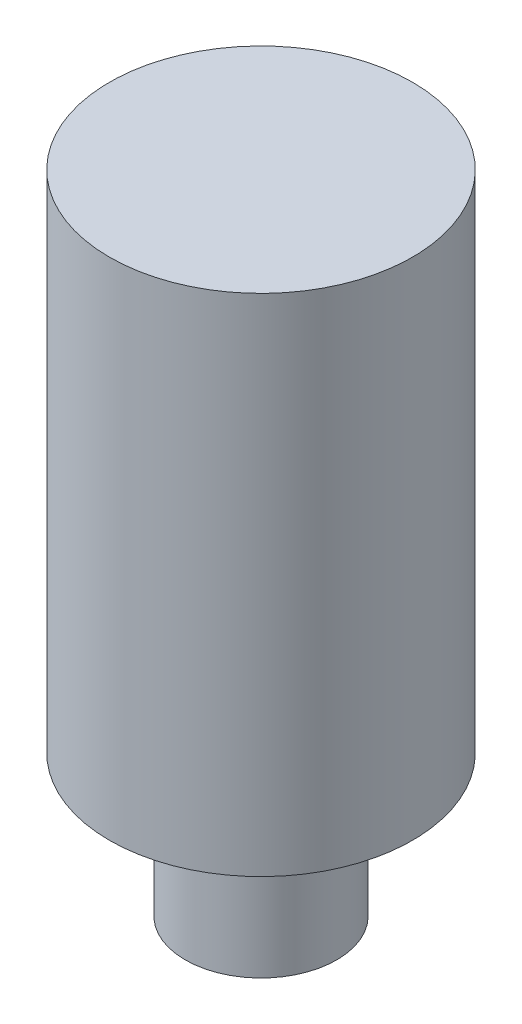
ISO-10303-21;
HEADER;
FILE_DESCRIPTION(('STEP AP214'),'2;1');
FILE_NAME('part.step','',(''),(''),'','','');
FILE_SCHEMA(('AUTOMOTIVE_DESIGN { 1 0 10303 214 1 1 1 1 }'));
ENDSEC;
DATA;
#1=APPLICATION_CONTEXT('core data for automotive mechanical design processes');
#2=APPLICATION_PROTOCOL_DEFINITION('international standard','automotive_design',2000,#1);
#3=PRODUCT_CONTEXT('',#1,'mechanical');
#4=PRODUCT('Part','Part','',(#3));
#5=PRODUCT_RELATED_PRODUCT_CATEGORY('part','',(#4));
#6=PRODUCT_DEFINITION_FORMATION('','',#4);
#7=PRODUCT_DEFINITION_CONTEXT('part definition',#1,'design');
#8=PRODUCT_DEFINITION('design','',#6,#7);
#9=PRODUCT_DEFINITION_SHAPE('','',#8);
#10=(LENGTH_UNIT() NAMED_UNIT(*) SI_UNIT(.MILLI.,.METRE.));
#11=(NAMED_UNIT(*) PLANE_ANGLE_UNIT() SI_UNIT($,.RADIAN.));
#12=(NAMED_UNIT(*) SI_UNIT($,.STERADIAN.) SOLID_ANGLE_UNIT());
#13=UNCERTAINTY_MEASURE_WITH_UNIT(LENGTH_MEASURE(1.E-05),#10,'distance_accuracy_value','');
#14=(GEOMETRIC_REPRESENTATION_CONTEXT(3) GLOBAL_UNCERTAINTY_ASSIGNED_CONTEXT((#13)) GLOBAL_UNIT_ASSIGNED_CONTEXT((#10,
#11,#12)) REPRESENTATION_CONTEXT('',''));
#15=CARTESIAN_POINT('',(0.,0.,0.));
#16=DIRECTION('',(0.,0.,1.));
#17=DIRECTION('',(1.,0.,0.));
#18=AXIS2_PLACEMENT_3D('',#15,#16,#17);
#19=CARTESIAN_POINT('',(0.,2.8,0.));
#20=DIRECTION('',(0.,-1.,0.));
#21=DIRECTION('',(0.,0.,-1.));
#22=AXIS2_PLACEMENT_3D('',#19,#20,#21);
#23=CYLINDRICAL_SURFACE('',#22,1.5);
#24=CARTESIAN_POINT('',(0.,2.8,0.));
#25=DIRECTION('',(0.,1.,0.));
#26=DIRECTION('',(0.,0.,1.));
#27=AXIS2_PLACEMENT_3D('',#24,#25,#26);
#28=CIRCLE('',#27,1.5);
#29=CARTESIAN_POINT('',(0.,2.8,1.5));
#30=VERTEX_POINT('',#29);
#31=EDGE_CURVE('E10',#30,#30,#28,.T.);
#32=ORIENTED_EDGE('',*,*,#31,.F.);
#33=EDGE_LOOP('',(#32));
#34=FACE_BOUND('',#33,.T.);
#35=CARTESIAN_POINT('',(0.,0.,0.));
#36=DIRECTION('',(0.,1.,0.));
#37=DIRECTION('',(0.,0.,1.));
#38=AXIS2_PLACEMENT_3D('',#35,#36,#37);
#39=CIRCLE('',#38,1.5);
#40=CARTESIAN_POINT('',(0.,0.,1.5));
#41=VERTEX_POINT('',#40);
#42=EDGE_CURVE('E40',#41,#41,#39,.T.);
#43=ORIENTED_EDGE('',*,*,#42,.T.);
#44=EDGE_LOOP('',(#43));
#45=FACE_BOUND('',#44,.T.);
#46=ADVANCED_FACE('F37',(#34,#45),#23,.T.);
#47=CARTESIAN_POINT('',(0.,0.,0.));
#48=DIRECTION('',(0.,1.,0.));
#49=DIRECTION('',(0.,0.,1.));
#50=AXIS2_PLACEMENT_3D('',#47,#48,#49);
#51=PLANE('',#50);
#52=ORIENTED_EDGE('',*,*,#42,.F.);
#53=EDGE_LOOP('',(#52));
#54=FACE_BOUND('',#53,.T.);
#55=ADVANCED_FACE('F64',(#54),#51,.F.);
#56=CARTESIAN_POINT('',(0.,12.8,0.));
#57=DIRECTION('',(0.,-1.,0.));
#58=DIRECTION('',(0.,0.,-1.));
#59=AXIS2_PLACEMENT_3D('',#56,#57,#58);
#60=CYLINDRICAL_SURFACE('',#59,3.);
#61=CARTESIAN_POINT('',(0.,12.8,0.));
#62=DIRECTION('',(0.,1.,0.));
#63=DIRECTION('',(0.,0.,1.));
#64=AXIS2_PLACEMENT_3D('',#61,#62,#63);
#65=CIRCLE('',#64,3.);
#66=CARTESIAN_POINT('',(0.,12.8,3.));
#67=VERTEX_POINT('',#66);
#68=EDGE_CURVE('E49',#67,#67,#65,.T.);
#69=ORIENTED_EDGE('',*,*,#68,.F.);
#70=EDGE_LOOP('',(#69));
#71=FACE_BOUND('',#70,.T.);
#72=CARTESIAN_POINT('',(0.,2.8,0.));
#73=DIRECTION('',(0.,1.,0.));
#74=DIRECTION('',(0.,0.,1.));
#75=AXIS2_PLACEMENT_3D('',#72,#73,#74);
#76=CIRCLE('',#75,3.);
#77=CARTESIAN_POINT('',(0.,2.8,3.));
#78=VERTEX_POINT('',#77);
#79=EDGE_CURVE('E51',#78,#78,#76,.T.);
#80=ORIENTED_EDGE('',*,*,#79,.T.);
#81=EDGE_LOOP('',(#80));
#82=FACE_BOUND('',#81,.T.);
#83=ADVANCED_FACE('F61',(#71,#82),#60,.T.);
#84=CARTESIAN_POINT('',(0.,12.8,0.));
#85=DIRECTION('',(0.,1.,0.));
#86=DIRECTION('',(0.,0.,1.));
#87=AXIS2_PLACEMENT_3D('',#84,#85,#86);
#88=PLANE('',#87);
#89=ORIENTED_EDGE('',*,*,#68,.T.);
#90=EDGE_LOOP('',(#89));
#91=FACE_BOUND('',#90,.T.);
#92=ADVANCED_FACE('F59',(#91),#88,.T.);
#93=CARTESIAN_POINT('',(0.,2.8,0.));
#94=DIRECTION('',(0.,1.,0.));
#95=DIRECTION('',(0.,0.,1.));
#96=AXIS2_PLACEMENT_3D('',#93,#94,#95);
#97=PLANE('',#96);
#98=ORIENTED_EDGE('',*,*,#31,.T.);
#99=EDGE_LOOP('',(#98));
#100=FACE_BOUND('',#99,.T.);
#101=ORIENTED_EDGE('',*,*,#79,.F.);
#102=EDGE_LOOP('',(#101));
#103=FACE_BOUND('',#102,.T.);
#104=ADVANCED_FACE('F68',(#100,#103),#97,.F.);
#105=CLOSED_SHELL('',(#46,#55,#83,#92,#104));
#106=MANIFOLD_SOLID_BREP('B2',#105);
#107=ADVANCED_BREP_SHAPE_REPRESENTATION('',(#18,#106),#14);
#108=SHAPE_DEFINITION_REPRESENTATION(#9,#107);
ENDSEC;
END-ISO-10303-21;
